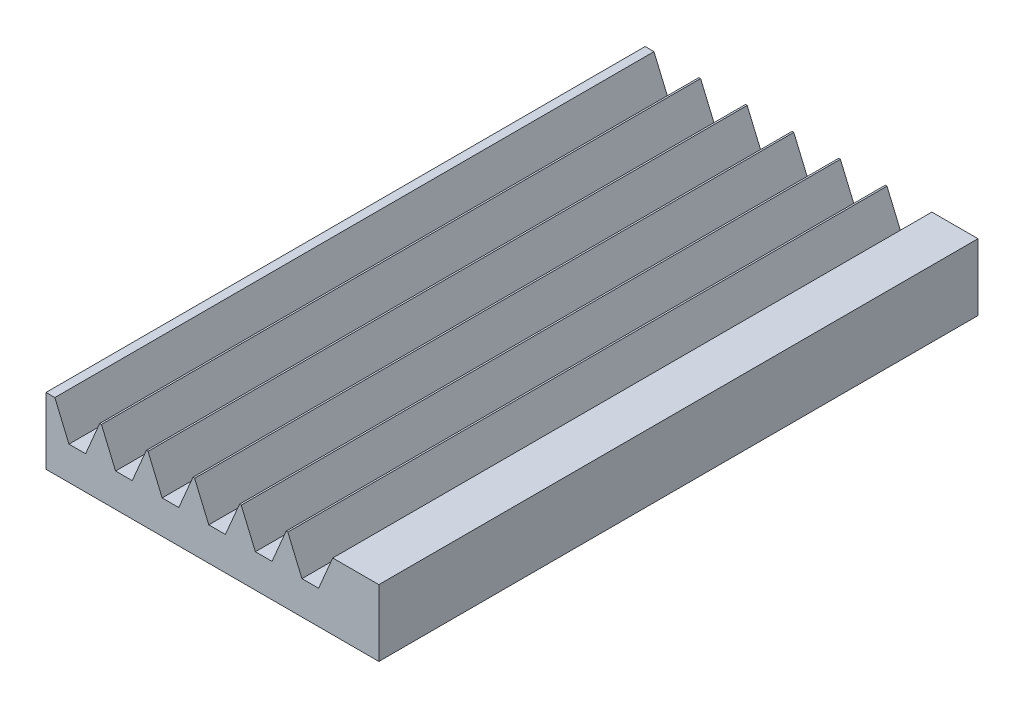
ISO-10303-21;
HEADER;
FILE_DESCRIPTION(('STEP AP214'),'2;1');
FILE_NAME('part.step','',(''),(''),'','','');
FILE_SCHEMA(('AUTOMOTIVE_DESIGN { 1 0 10303 214 1 1 1 1 }'));
ENDSEC;
DATA;
#1=APPLICATION_CONTEXT('core data for automotive mechanical design processes');
#2=APPLICATION_PROTOCOL_DEFINITION('international standard','automotive_design',2000,#1);
#3=PRODUCT_CONTEXT('',#1,'mechanical');
#4=PRODUCT('Part','Part','',(#3));
#5=PRODUCT_RELATED_PRODUCT_CATEGORY('part','',(#4));
#6=PRODUCT_DEFINITION_FORMATION('','',#4);
#7=PRODUCT_DEFINITION_CONTEXT('part definition',#1,'design');
#8=PRODUCT_DEFINITION('design','',#6,#7);
#9=PRODUCT_DEFINITION_SHAPE('','',#8);
#10=(LENGTH_UNIT() NAMED_UNIT(*) SI_UNIT(.MILLI.,.METRE.));
#11=(NAMED_UNIT(*) PLANE_ANGLE_UNIT() SI_UNIT($,.RADIAN.));
#12=(NAMED_UNIT(*) SI_UNIT($,.STERADIAN.) SOLID_ANGLE_UNIT());
#13=UNCERTAINTY_MEASURE_WITH_UNIT(LENGTH_MEASURE(1.E-05),#10,'distance_accuracy_value','');
#14=(GEOMETRIC_REPRESENTATION_CONTEXT(3) GLOBAL_UNCERTAINTY_ASSIGNED_CONTEXT((#13)) GLOBAL_UNIT_ASSIGNED_CONTEXT((#10,
#11,#12)) REPRESENTATION_CONTEXT('',''));
#15=CARTESIAN_POINT('',(0.,0.,0.));
#16=DIRECTION('',(0.,0.,1.));
#17=DIRECTION('',(1.,0.,0.));
#18=AXIS2_PLACEMENT_3D('',#15,#16,#17);
#19=CARTESIAN_POINT('',(0.,2.,-13.));
#20=DIRECTION('',(0.,1.,0.));
#21=DIRECTION('',(0.,0.,1.));
#22=AXIS2_PLACEMENT_3D('',#19,#20,#21);
#23=PLANE('',#22);
#24=DIRECTION('',(0.,0.,-1.));
#25=VECTOR('',#24,1.);
#26=CARTESIAN_POINT('',(3.01429944988273,2.,-13.));
#27=LINE('',#26,#25);
#28=CARTESIAN_POINT('',(3.01429944988273,2.,5.));
#29=VERTEX_POINT('',#28);
#30=CARTESIAN_POINT('',(3.01429944988273,2.,-13.));
#31=VERTEX_POINT('',#30);
#32=EDGE_CURVE('E337',#29,#31,#27,.T.);
#33=ORIENTED_EDGE('',*,*,#32,.F.);
#34=DIRECTION('',(-1.,0.,0.));
#35=VECTOR('',#34,1.);
#36=CARTESIAN_POINT('',(0.,2.,5.));
#37=LINE('',#36,#35);
#38=CARTESIAN_POINT('',(3.06534981746351,2.,5.));
#39=VERTEX_POINT('',#38);
#40=EDGE_CURVE('E418',#39,#29,#37,.T.);
#41=ORIENTED_EDGE('',*,*,#40,.F.);
#42=DIRECTION('',(0.,0.,1.));
#43=VECTOR('',#42,1.);
#44=CARTESIAN_POINT('',(3.06534981746351,2.,-13.));
#45=LINE('',#44,#43);
#46=CARTESIAN_POINT('',(3.06534981746351,2.,-13.));
#47=VERTEX_POINT('',#46);
#48=EDGE_CURVE('E55',#47,#39,#45,.T.);
#49=ORIENTED_EDGE('',*,*,#48,.F.);
#50=DIRECTION('',(-1.,0.,0.));
#51=VECTOR('',#50,1.);
#52=CARTESIAN_POINT('',(0.,2.,-13.));
#53=LINE('',#52,#51);
#54=EDGE_CURVE('E581',#47,#31,#53,.T.);
#55=ORIENTED_EDGE('',*,*,#54,.T.);
#56=EDGE_LOOP('',(#33,#41,#49,#55));
#57=FACE_BOUND('',#56,.T.);
#58=ADVANCED_FACE('F33',(#57),#23,.T.);
#59=DIRECTION('',(0.,0.,-1.));
#60=VECTOR('',#59,1.);
#61=CARTESIAN_POINT('',(4.41429944988273,2.,-13.));
#62=LINE('',#61,#60);
#63=CARTESIAN_POINT('',(4.41429944988273,2.,5.));
#64=VERTEX_POINT('',#63);
#65=CARTESIAN_POINT('',(4.41429944988273,2.,-13.));
#66=VERTEX_POINT('',#65);
#67=EDGE_CURVE('E334',#64,#66,#62,.T.);
#68=ORIENTED_EDGE('',*,*,#67,.F.);
#69=CARTESIAN_POINT('',(4.46534981746351,2.,5.));
#70=VERTEX_POINT('',#69);
#71=EDGE_CURVE('E424',#70,#64,#37,.T.);
#72=ORIENTED_EDGE('',*,*,#71,.F.);
#73=DIRECTION('',(0.,0.,1.));
#74=VECTOR('',#73,1.);
#75=CARTESIAN_POINT('',(4.46534981746351,2.,-13.));
#76=LINE('',#75,#74);
#77=CARTESIAN_POINT('',(4.46534981746351,2.,-13.));
#78=VERTEX_POINT('',#77);
#79=EDGE_CURVE('E329',#78,#70,#76,.T.);
#80=ORIENTED_EDGE('',*,*,#79,.F.);
#81=EDGE_CURVE('E459',#78,#66,#53,.T.);
#82=ORIENTED_EDGE('',*,*,#81,.T.);
#83=EDGE_LOOP('',(#68,#72,#80,#82));
#84=FACE_BOUND('',#83,.T.);
#85=ADVANCED_FACE('F457',(#84),#23,.T.);
#86=DIRECTION('',(0.,0.,-1.));
#87=VECTOR('',#86,1.);
#88=CARTESIAN_POINT('',(5.81429944988273,2.,-13.));
#89=LINE('',#88,#87);
#90=CARTESIAN_POINT('',(5.81429944988273,2.,5.));
#91=VERTEX_POINT('',#90);
#92=CARTESIAN_POINT('',(5.81429944988273,2.,-13.));
#93=VERTEX_POINT('',#92);
#94=EDGE_CURVE('E331',#91,#93,#89,.T.);
#95=ORIENTED_EDGE('',*,*,#94,.F.);
#96=CARTESIAN_POINT('',(5.86534981746351,2.,5.));
#97=VERTEX_POINT('',#96);
#98=EDGE_CURVE('E426',#97,#91,#37,.T.);
#99=ORIENTED_EDGE('',*,*,#98,.F.);
#100=DIRECTION('',(0.,0.,1.));
#101=VECTOR('',#100,1.);
#102=CARTESIAN_POINT('',(5.86534981746351,2.,-13.));
#103=LINE('',#102,#101);
#104=CARTESIAN_POINT('',(5.86534981746351,2.,-13.));
#105=VERTEX_POINT('',#104);
#106=EDGE_CURVE('E325',#105,#97,#103,.T.);
#107=ORIENTED_EDGE('',*,*,#106,.F.);
#108=EDGE_CURVE('E444',#105,#93,#53,.T.);
#109=ORIENTED_EDGE('',*,*,#108,.T.);
#110=EDGE_LOOP('',(#95,#99,#107,#109));
#111=FACE_BOUND('',#110,.T.);
#112=ADVANCED_FACE('F441',(#111),#23,.T.);
#113=DIRECTION('',(0.,0.,-1.));
#114=VECTOR('',#113,1.);
#115=CARTESIAN_POINT('',(7.21429944988273,2.,-13.));
#116=LINE('',#115,#114);
#117=CARTESIAN_POINT('',(7.21429944988273,2.,5.));
#118=VERTEX_POINT('',#117);
#119=CARTESIAN_POINT('',(7.21429944988273,2.,-13.));
#120=VERTEX_POINT('',#119);
#121=EDGE_CURVE('E327',#118,#120,#116,.T.);
#122=ORIENTED_EDGE('',*,*,#121,.F.);
#123=CARTESIAN_POINT('',(7.26534981746351,2.,5.));
#124=VERTEX_POINT('',#123);
#125=EDGE_CURVE('E377',#124,#118,#37,.T.);
#126=ORIENTED_EDGE('',*,*,#125,.F.);
#127=DIRECTION('',(0.,0.,1.));
#128=VECTOR('',#127,1.);
#129=CARTESIAN_POINT('',(7.26534981746351,2.,-13.));
#130=LINE('',#129,#128);
#131=CARTESIAN_POINT('',(7.26534981746351,2.,-13.));
#132=VERTEX_POINT('',#131);
#133=EDGE_CURVE('E245',#132,#124,#130,.T.);
#134=ORIENTED_EDGE('',*,*,#133,.F.);
#135=EDGE_CURVE('E392',#132,#120,#53,.T.);
#136=ORIENTED_EDGE('',*,*,#135,.T.);
#137=EDGE_LOOP('',(#122,#126,#134,#136));
#138=FACE_BOUND('',#137,.T.);
#139=ADVANCED_FACE('F504',(#138),#23,.T.);
#140=DIRECTION('',(0.,0.,-1.));
#141=VECTOR('',#140,1.);
#142=CARTESIAN_POINT('',(8.61429944988273,2.,-13.));
#143=LINE('',#142,#141);
#144=CARTESIAN_POINT('',(8.61429944988273,2.,5.));
#145=VERTEX_POINT('',#144);
#146=CARTESIAN_POINT('',(8.61429944988273,2.,-13.));
#147=VERTEX_POINT('',#146);
#148=EDGE_CURVE('E323',#145,#147,#143,.T.);
#149=ORIENTED_EDGE('',*,*,#148,.F.);
#150=CARTESIAN_POINT('',(10.,2.,5.));
#151=VERTEX_POINT('',#150);
#152=EDGE_CURVE('E373',#151,#145,#37,.T.);
#153=ORIENTED_EDGE('',*,*,#152,.F.);
#154=DIRECTION('',(0.,0.,1.));
#155=VECTOR('',#154,1.);
#156=CARTESIAN_POINT('',(10.,2.,-13.));
#157=LINE('',#156,#155);
#158=CARTESIAN_POINT('',(10.,2.,-13.));
#159=VERTEX_POINT('',#158);
#160=EDGE_CURVE('E397',#159,#151,#157,.T.);
#161=ORIENTED_EDGE('',*,*,#160,.F.);
#162=EDGE_CURVE('E388',#159,#147,#53,.T.);
#163=ORIENTED_EDGE('',*,*,#162,.T.);
#164=EDGE_LOOP('',(#149,#153,#161,#163));
#165=FACE_BOUND('',#164,.T.);
#166=ADVANCED_FACE('F499',(#165),#23,.T.);
#167=DIRECTION('',(0.,0.,1.));
#168=VECTOR('',#167,1.);
#169=CARTESIAN_POINT('',(1.66534981746351,2.,-13.));
#170=LINE('',#169,#168);
#171=CARTESIAN_POINT('',(1.66534981746351,2.,-13.));
#172=VERTEX_POINT('',#171);
#173=CARTESIAN_POINT('',(1.66534981746351,2.,5.));
#174=VERTEX_POINT('',#173);
#175=EDGE_CURVE('E48',#172,#174,#170,.T.);
#176=ORIENTED_EDGE('',*,*,#175,.F.);
#177=CARTESIAN_POINT('',(1.61429944988273,2.,-13.));
#178=VERTEX_POINT('',#177);
#179=EDGE_CURVE('E235',#172,#178,#53,.T.);
#180=ORIENTED_EDGE('',*,*,#179,.T.);
#181=DIRECTION('',(0.,0.,-1.));
#182=VECTOR('',#181,1.);
#183=CARTESIAN_POINT('',(1.61429944988273,2.,-13.));
#184=LINE('',#183,#182);
#185=CARTESIAN_POINT('',(1.61429944988273,2.,5.));
#186=VERTEX_POINT('',#185);
#187=EDGE_CURVE('E360',#186,#178,#184,.T.);
#188=ORIENTED_EDGE('',*,*,#187,.F.);
#189=EDGE_CURVE('E378',#174,#186,#37,.T.);
#190=ORIENTED_EDGE('',*,*,#189,.F.);
#191=EDGE_LOOP('',(#176,#180,#188,#190));
#192=FACE_BOUND('',#191,.T.);
#193=ADVANCED_FACE('F489',(#192),#23,.T.);
#194=CARTESIAN_POINT('',(0.,0.,-13.));
#195=DIRECTION('',(-1.,0.,0.));
#196=DIRECTION('',(0.,0.,1.));
#197=AXIS2_PLACEMENT_3D('',#194,#195,#196);
#198=PLANE('',#197);
#199=DIRECTION('',(0.,0.,1.));
#200=VECTOR('',#199,1.);
#201=CARTESIAN_POINT('',(0.,0.,-13.));
#202=LINE('',#201,#200);
#203=CARTESIAN_POINT('',(0.,0.,-13.));
#204=VERTEX_POINT('',#203);
#205=CARTESIAN_POINT('',(0.,0.,5.));
#206=VERTEX_POINT('',#205);
#207=EDGE_CURVE('E391',#204,#206,#202,.T.);
#208=ORIENTED_EDGE('',*,*,#207,.T.);
#209=DIRECTION('',(0.,-1.,0.));
#210=VECTOR('',#209,1.);
#211=CARTESIAN_POINT('',(0.,0.,5.));
#212=LINE('',#211,#210);
#213=CARTESIAN_POINT('',(0.,2.,5.));
#214=VERTEX_POINT('',#213);
#215=EDGE_CURVE('E363',#214,#206,#212,.T.);
#216=ORIENTED_EDGE('',*,*,#215,.F.);
#217=DIRECTION('',(0.,0.,1.));
#218=VECTOR('',#217,1.);
#219=CARTESIAN_POINT('',(0.,2.,-13.));
#220=LINE('',#219,#218);
#221=CARTESIAN_POINT('',(0.,2.,-13.));
#222=VERTEX_POINT('',#221);
#223=EDGE_CURVE('E393',#222,#214,#220,.T.);
#224=ORIENTED_EDGE('',*,*,#223,.F.);
#225=DIRECTION('',(0.,-1.,0.));
#226=VECTOR('',#225,1.);
#227=CARTESIAN_POINT('',(0.,0.,-13.));
#228=LINE('',#227,#226);
#229=EDGE_CURVE('E376',#222,#204,#228,.T.);
#230=ORIENTED_EDGE('',*,*,#229,.T.);
#231=EDGE_LOOP('',(#208,#216,#224,#230));
#232=FACE_BOUND('',#231,.T.);
#233=ADVANCED_FACE('F35',(#232),#198,.T.);
#234=DIRECTION('',(0.,0.,1.));
#235=VECTOR('',#234,1.);
#236=CARTESIAN_POINT('',(0.265349817463512,2.,-13.));
#237=LINE('',#236,#235);
#238=CARTESIAN_POINT('',(0.265349817463512,2.,-13.));
#239=VERTEX_POINT('',#238);
#240=CARTESIAN_POINT('',(0.265349817463512,2.,5.));
#241=VERTEX_POINT('',#240);
#242=EDGE_CURVE('E356',#239,#241,#237,.T.);
#243=ORIENTED_EDGE('',*,*,#242,.F.);
#244=EDGE_CURVE('E387',#239,#222,#53,.T.);
#245=ORIENTED_EDGE('',*,*,#244,.T.);
#246=ORIENTED_EDGE('',*,*,#223,.T.);
#247=EDGE_CURVE('E372',#241,#214,#37,.T.);
#248=ORIENTED_EDGE('',*,*,#247,.F.);
#249=EDGE_LOOP('',(#243,#245,#246,#248));
#250=FACE_BOUND('',#249,.T.);
#251=ADVANCED_FACE('F480',(#250),#23,.T.);
#252=CARTESIAN_POINT('',(10.,0.,-13.));
#253=DIRECTION('',(1.,0.,0.));
#254=DIRECTION('',(0.,0.,-1.));
#255=AXIS2_PLACEMENT_3D('',#252,#253,#254);
#256=PLANE('',#255);
#257=ORIENTED_EDGE('',*,*,#160,.T.);
#258=DIRECTION('',(0.,1.,0.));
#259=VECTOR('',#258,1.);
#260=CARTESIAN_POINT('',(10.,0.,5.));
#261=LINE('',#260,#259);
#262=CARTESIAN_POINT('',(10.,0.,5.));
#263=VERTEX_POINT('',#262);
#264=EDGE_CURVE('E369',#263,#151,#261,.T.);
#265=ORIENTED_EDGE('',*,*,#264,.F.);
#266=DIRECTION('',(0.,0.,1.));
#267=VECTOR('',#266,1.);
#268=CARTESIAN_POINT('',(10.,0.,-13.));
#269=LINE('',#268,#267);
#270=CARTESIAN_POINT('',(10.,0.,-13.));
#271=VERTEX_POINT('',#270);
#272=EDGE_CURVE('E399',#271,#263,#269,.T.);
#273=ORIENTED_EDGE('',*,*,#272,.F.);
#274=DIRECTION('',(0.,1.,0.));
#275=VECTOR('',#274,1.);
#276=CARTESIAN_POINT('',(10.,0.,-13.));
#277=LINE('',#276,#275);
#278=EDGE_CURVE('E384',#271,#159,#277,.T.);
#279=ORIENTED_EDGE('',*,*,#278,.T.);
#280=EDGE_LOOP('',(#257,#265,#273,#279));
#281=FACE_BOUND('',#280,.T.);
#282=ADVANCED_FACE('F487',(#281),#256,.T.);
#283=CARTESIAN_POINT('',(0.,0.,-13.));
#284=DIRECTION('',(0.,-1.,0.));
#285=DIRECTION('',(0.,0.,-1.));
#286=AXIS2_PLACEMENT_3D('',#283,#284,#285);
#287=PLANE('',#286);
#288=ORIENTED_EDGE('',*,*,#272,.T.);
#289=DIRECTION('',(1.,0.,0.));
#290=VECTOR('',#289,1.);
#291=CARTESIAN_POINT('',(0.,0.,5.));
#292=LINE('',#291,#290);
#293=EDGE_CURVE('E366',#206,#263,#292,.T.);
#294=ORIENTED_EDGE('',*,*,#293,.F.);
#295=ORIENTED_EDGE('',*,*,#207,.F.);
#296=DIRECTION('',(1.,0.,0.));
#297=VECTOR('',#296,1.);
#298=CARTESIAN_POINT('',(0.,0.,-13.));
#299=LINE('',#298,#297);
#300=EDGE_CURVE('E381',#204,#271,#299,.T.);
#301=ORIENTED_EDGE('',*,*,#300,.T.);
#302=EDGE_LOOP('',(#288,#294,#295,#301));
#303=FACE_BOUND('',#302,.T.);
#304=ADVANCED_FACE('F494',(#303),#287,.T.);
#305=CARTESIAN_POINT('',(0.,0.,-13.));
#306=DIRECTION('',(0.,0.,-1.));
#307=DIRECTION('',(-1.,0.,0.));
#308=AXIS2_PLACEMENT_3D('',#305,#306,#307);
#309=PLANE('',#308);
#310=DIRECTION('',(0.390731128489277,0.920504853452439,0.));
#311=VECTOR('',#310,1.);
#312=CARTESIAN_POINT('',(3.01962887501133,2.01255533879768,-13.));
#313=LINE('',#312,#311);
#314=CARTESIAN_POINT('',(2.58982463367312,1.,-13.));
#315=VERTEX_POINT('',#314);
#316=EDGE_CURVE('E236',#315,#31,#313,.T.);
#317=ORIENTED_EDGE('',*,*,#316,.T.);
#318=ORIENTED_EDGE('',*,*,#54,.F.);
#319=DIRECTION('',(0.390731128489278,-0.920504853452439,0.));
#320=VECTOR('',#319,1.);
#321=CARTESIAN_POINT('',(3.48982463367312,1.,-13.));
#322=LINE('',#321,#320);
#323=CARTESIAN_POINT('',(3.48982463367312,1.,-13.));
#324=VERTEX_POINT('',#323);
#325=EDGE_CURVE('E250',#47,#324,#322,.T.);
#326=ORIENTED_EDGE('',*,*,#325,.T.);
#327=DIRECTION('',(1.,0.,0.));
#328=VECTOR('',#327,1.);
#329=CARTESIAN_POINT('',(3.48982463367312,1.,-13.));
#330=LINE('',#329,#328);
#331=CARTESIAN_POINT('',(3.98982463367312,1.,-13.));
#332=VERTEX_POINT('',#331);
#333=EDGE_CURVE('E254',#324,#332,#330,.T.);
#334=ORIENTED_EDGE('',*,*,#333,.T.);
#335=DIRECTION('',(0.390731128489277,0.920504853452439,0.));
#336=VECTOR('',#335,1.);
#337=CARTESIAN_POINT('',(4.41962887501133,2.01255533879768,-13.));
#338=LINE('',#337,#336);
#339=EDGE_CURVE('E247',#332,#66,#338,.T.);
#340=ORIENTED_EDGE('',*,*,#339,.T.);
#341=ORIENTED_EDGE('',*,*,#81,.F.);
#342=DIRECTION('',(0.390731128489278,-0.920504853452439,0.));
#343=VECTOR('',#342,1.);
#344=CARTESIAN_POINT('',(4.88982463367312,1.,-13.));
#345=LINE('',#344,#343);
#346=CARTESIAN_POINT('',(4.88982463367312,1.,-13.));
#347=VERTEX_POINT('',#346);
#348=EDGE_CURVE('E269',#78,#347,#345,.T.);
#349=ORIENTED_EDGE('',*,*,#348,.T.);
#350=DIRECTION('',(1.,0.,0.));
#351=VECTOR('',#350,1.);
#352=CARTESIAN_POINT('',(4.88982463367312,1.,-13.));
#353=LINE('',#352,#351);
#354=CARTESIAN_POINT('',(5.38982463367312,1.,-13.));
#355=VERTEX_POINT('',#354);
#356=EDGE_CURVE('E273',#347,#355,#353,.T.);
#357=ORIENTED_EDGE('',*,*,#356,.T.);
#358=DIRECTION('',(0.390731128489277,0.920504853452439,0.));
#359=VECTOR('',#358,1.);
#360=CARTESIAN_POINT('',(5.81962887501133,2.01255533879768,-13.));
#361=LINE('',#360,#359);
#362=EDGE_CURVE('E266',#355,#93,#361,.T.);
#363=ORIENTED_EDGE('',*,*,#362,.T.);
#364=ORIENTED_EDGE('',*,*,#108,.F.);
#365=DIRECTION('',(0.390731128489278,-0.920504853452439,0.));
#366=VECTOR('',#365,1.);
#367=CARTESIAN_POINT('',(6.28982463367312,1.,-13.));
#368=LINE('',#367,#366);
#369=CARTESIAN_POINT('',(6.28982463367312,1.,-13.));
#370=VERTEX_POINT('',#369);
#371=EDGE_CURVE('E288',#105,#370,#368,.T.);
#372=ORIENTED_EDGE('',*,*,#371,.T.);
#373=DIRECTION('',(1.,0.,0.));
#374=VECTOR('',#373,1.);
#375=CARTESIAN_POINT('',(6.28982463367312,1.,-13.));
#376=LINE('',#375,#374);
#377=CARTESIAN_POINT('',(6.78982463367312,1.,-13.));
#378=VERTEX_POINT('',#377);
#379=EDGE_CURVE('E292',#370,#378,#376,.T.);
#380=ORIENTED_EDGE('',*,*,#379,.T.);
#381=DIRECTION('',(0.390731128489277,0.920504853452439,0.));
#382=VECTOR('',#381,1.);
#383=CARTESIAN_POINT('',(7.21962887501133,2.01255533879768,-13.));
#384=LINE('',#383,#382);
#385=EDGE_CURVE('E285',#378,#120,#384,.T.);
#386=ORIENTED_EDGE('',*,*,#385,.T.);
#387=ORIENTED_EDGE('',*,*,#135,.F.);
#388=DIRECTION('',(0.390731128489278,-0.920504853452439,0.));
#389=VECTOR('',#388,1.);
#390=CARTESIAN_POINT('',(7.68982463367312,1.,-13.));
#391=LINE('',#390,#389);
#392=CARTESIAN_POINT('',(7.68982463367312,1.,-13.));
#393=VERTEX_POINT('',#392);
#394=EDGE_CURVE('E307',#132,#393,#391,.T.);
#395=ORIENTED_EDGE('',*,*,#394,.T.);
#396=DIRECTION('',(1.,0.,0.));
#397=VECTOR('',#396,1.);
#398=CARTESIAN_POINT('',(7.68982463367312,1.,-13.));
#399=LINE('',#398,#397);
#400=CARTESIAN_POINT('',(8.18982463367312,1.,-13.));
#401=VERTEX_POINT('',#400);
#402=EDGE_CURVE('E311',#393,#401,#399,.T.);
#403=ORIENTED_EDGE('',*,*,#402,.T.);
#404=DIRECTION('',(0.390731128489277,0.920504853452439,0.));
#405=VECTOR('',#404,1.);
#406=CARTESIAN_POINT('',(8.61962887501133,2.01255533879768,-13.));
#407=LINE('',#406,#405);
#408=EDGE_CURVE('E304',#401,#147,#407,.T.);
#409=ORIENTED_EDGE('',*,*,#408,.T.);
#410=ORIENTED_EDGE('',*,*,#162,.F.);
#411=ORIENTED_EDGE('',*,*,#278,.F.);
#412=ORIENTED_EDGE('',*,*,#300,.F.);
#413=ORIENTED_EDGE('',*,*,#229,.F.);
#414=ORIENTED_EDGE('',*,*,#244,.F.);
#415=DIRECTION('',(0.390731128489278,-0.920504853452439,0.));
#416=VECTOR('',#415,1.);
#417=CARTESIAN_POINT('',(0.689824633673122,1.,-13.));
#418=LINE('',#417,#416);
#419=CARTESIAN_POINT('',(0.689824633673122,1.,-13.));
#420=VERTEX_POINT('',#419);
#421=EDGE_CURVE('E342',#239,#420,#418,.T.);
#422=ORIENTED_EDGE('',*,*,#421,.T.);
#423=DIRECTION('',(1.,0.,0.));
#424=VECTOR('',#423,1.);
#425=CARTESIAN_POINT('',(0.689824633673122,1.,-13.));
#426=LINE('',#425,#424);
#427=CARTESIAN_POINT('',(1.18982463367312,1.,-13.));
#428=VERTEX_POINT('',#427);
#429=EDGE_CURVE('E346',#420,#428,#426,.T.);
#430=ORIENTED_EDGE('',*,*,#429,.T.);
#431=DIRECTION('',(0.390731128489277,0.920504853452439,0.));
#432=VECTOR('',#431,1.);
#433=CARTESIAN_POINT('',(1.61962887501133,2.01255533879768,-13.));
#434=LINE('',#433,#432);
#435=EDGE_CURVE('E340',#428,#178,#434,.T.);
#436=ORIENTED_EDGE('',*,*,#435,.T.);
#437=ORIENTED_EDGE('',*,*,#179,.F.);
#438=DIRECTION('',(0.390731128489278,-0.920504853452439,0.));
#439=VECTOR('',#438,1.);
#440=CARTESIAN_POINT('',(2.08982463367312,1.,-13.));
#441=LINE('',#440,#439);
#442=CARTESIAN_POINT('',(2.08982463367312,1.,-13.));
#443=VERTEX_POINT('',#442);
#444=EDGE_CURVE('E219',#172,#443,#441,.T.);
#445=ORIENTED_EDGE('',*,*,#444,.T.);
#446=DIRECTION('',(1.,0.,0.));
#447=VECTOR('',#446,1.);
#448=CARTESIAN_POINT('',(2.08982463367312,1.,-13.));
#449=LINE('',#448,#447);
#450=EDGE_CURVE('E224',#443,#315,#449,.T.);
#451=ORIENTED_EDGE('',*,*,#450,.T.);
#452=EDGE_LOOP('',(#317,#318,#326,#334,#340,#341,#349,#357,#363,#364,#372,#380,#386,#387,#395,
#403,#409,#410,#411,#412,#413,#414,#422,#430,#436,#437,#445,#451));
#453=FACE_BOUND('',#452,.T.);
#454=ADVANCED_FACE('F233',(#453),#309,.T.);
#455=CARTESIAN_POINT('',(0.,0.,5.));
#456=DIRECTION('',(0.,0.,-1.));
#457=DIRECTION('',(-1.,0.,0.));
#458=AXIS2_PLACEMENT_3D('',#455,#456,#457);
#459=PLANE('',#458);
#460=ORIENTED_EDGE('',*,*,#40,.T.);
#461=DIRECTION('',(0.390731128489277,0.920504853452439,0.));
#462=VECTOR('',#461,1.);
#463=CARTESIAN_POINT('',(3.01962887501133,2.01255533879768,5.));
#464=LINE('',#463,#462);
#465=CARTESIAN_POINT('',(2.58982463367312,1.,5.));
#466=VERTEX_POINT('',#465);
#467=EDGE_CURVE('E241',#466,#29,#464,.T.);
#468=ORIENTED_EDGE('',*,*,#467,.F.);
#469=DIRECTION('',(1.,0.,0.));
#470=VECTOR('',#469,1.);
#471=CARTESIAN_POINT('',(2.08982463367312,1.,5.));
#472=LINE('',#471,#470);
#473=CARTESIAN_POINT('',(2.08982463367312,1.,5.));
#474=VERTEX_POINT('',#473);
#475=EDGE_CURVE('E238',#474,#466,#472,.T.);
#476=ORIENTED_EDGE('',*,*,#475,.F.);
#477=DIRECTION('',(-0.390731128489278,0.920504853452439,0.));
#478=VECTOR('',#477,1.);
#479=CARTESIAN_POINT('',(2.1304393042921,0.90431783213512,5.));
#480=LINE('',#479,#478);
#481=EDGE_CURVE('E11',#474,#174,#480,.T.);
#482=ORIENTED_EDGE('',*,*,#481,.T.);
#483=ORIENTED_EDGE('',*,*,#189,.T.);
#484=DIRECTION('',(0.390731128489277,0.920504853452439,0.));
#485=VECTOR('',#484,1.);
#486=CARTESIAN_POINT('',(1.61962887501133,2.01255533879768,5.));
#487=LINE('',#486,#485);
#488=CARTESIAN_POINT('',(1.18982463367312,1.,5.));
#489=VERTEX_POINT('',#488);
#490=EDGE_CURVE('E339',#489,#186,#487,.T.);
#491=ORIENTED_EDGE('',*,*,#490,.F.);
#492=DIRECTION('',(1.,0.,0.));
#493=VECTOR('',#492,1.);
#494=CARTESIAN_POINT('',(0.689824633673122,1.,5.));
#495=LINE('',#494,#493);
#496=CARTESIAN_POINT('',(0.689824633673122,1.,5.));
#497=VERTEX_POINT('',#496);
#498=EDGE_CURVE('E343',#497,#489,#495,.T.);
#499=ORIENTED_EDGE('',*,*,#498,.F.);
#500=DIRECTION('',(-0.390731128489278,0.920504853452439,0.));
#501=VECTOR('',#500,1.);
#502=CARTESIAN_POINT('',(0.94417844497081,0.40077997189806,5.));
#503=LINE('',#502,#501);
#504=EDGE_CURVE('E396',#497,#241,#503,.T.);
#505=ORIENTED_EDGE('',*,*,#504,.T.);
#506=ORIENTED_EDGE('',*,*,#247,.T.);
#507=ORIENTED_EDGE('',*,*,#215,.T.);
#508=ORIENTED_EDGE('',*,*,#293,.T.);
#509=ORIENTED_EDGE('',*,*,#264,.T.);
#510=ORIENTED_EDGE('',*,*,#152,.T.);
#511=DIRECTION('',(0.390731128489277,0.920504853452439,0.));
#512=VECTOR('',#511,1.);
#513=CARTESIAN_POINT('',(8.61962887501133,2.01255533879768,5.));
#514=LINE('',#513,#512);
#515=CARTESIAN_POINT('',(8.18982463367312,1.,5.));
#516=VERTEX_POINT('',#515);
#517=EDGE_CURVE('E315',#516,#145,#514,.T.);
#518=ORIENTED_EDGE('',*,*,#517,.F.);
#519=DIRECTION('',(1.,0.,0.));
#520=VECTOR('',#519,1.);
#521=CARTESIAN_POINT('',(7.68982463367312,1.,5.));
#522=LINE('',#521,#520);
#523=CARTESIAN_POINT('',(7.68982463367312,1.,5.));
#524=VERTEX_POINT('',#523);
#525=EDGE_CURVE('E308',#524,#516,#522,.T.);
#526=ORIENTED_EDGE('',*,*,#525,.F.);
#527=DIRECTION('',(-0.390731128489278,0.920504853452439,0.));
#528=VECTOR('',#527,1.);
#529=CARTESIAN_POINT('',(6.87548274157728,2.91846927308336,5.));
#530=LINE('',#529,#528);
#531=EDGE_CURVE('E404',#524,#124,#530,.T.);
#532=ORIENTED_EDGE('',*,*,#531,.T.);
#533=ORIENTED_EDGE('',*,*,#125,.T.);
#534=DIRECTION('',(0.390731128489277,0.920504853452439,0.));
#535=VECTOR('',#534,1.);
#536=CARTESIAN_POINT('',(7.21962887501133,2.01255533879768,5.));
#537=LINE('',#536,#535);
#538=CARTESIAN_POINT('',(6.78982463367312,1.,5.));
#539=VERTEX_POINT('',#538);
#540=EDGE_CURVE('E296',#539,#118,#537,.T.);
#541=ORIENTED_EDGE('',*,*,#540,.F.);
#542=DIRECTION('',(1.,0.,0.));
#543=VECTOR('',#542,1.);
#544=CARTESIAN_POINT('',(6.28982463367312,1.,5.));
#545=LINE('',#544,#543);
#546=CARTESIAN_POINT('',(6.28982463367312,1.,5.));
#547=VERTEX_POINT('',#546);
#548=EDGE_CURVE('E289',#547,#539,#545,.T.);
#549=ORIENTED_EDGE('',*,*,#548,.F.);
#550=DIRECTION('',(-0.390731128489278,0.920504853452439,0.));
#551=VECTOR('',#550,1.);
#552=CARTESIAN_POINT('',(5.68922188225598,2.4149314128463,5.));
#553=LINE('',#552,#551);
#554=EDGE_CURVE('E407',#547,#97,#553,.T.);
#555=ORIENTED_EDGE('',*,*,#554,.T.);
#556=ORIENTED_EDGE('',*,*,#98,.T.);
#557=DIRECTION('',(0.390731128489277,0.920504853452439,0.));
#558=VECTOR('',#557,1.);
#559=CARTESIAN_POINT('',(5.81962887501133,2.01255533879768,5.));
#560=LINE('',#559,#558);
#561=CARTESIAN_POINT('',(5.38982463367312,1.,5.));
#562=VERTEX_POINT('',#561);
#563=EDGE_CURVE('E277',#562,#91,#560,.T.);
#564=ORIENTED_EDGE('',*,*,#563,.F.);
#565=DIRECTION('',(1.,0.,0.));
#566=VECTOR('',#565,1.);
#567=CARTESIAN_POINT('',(4.88982463367312,1.,5.));
#568=LINE('',#567,#566);
#569=CARTESIAN_POINT('',(4.88982463367312,1.,5.));
#570=VERTEX_POINT('',#569);
#571=EDGE_CURVE('E270',#570,#562,#568,.T.);
#572=ORIENTED_EDGE('',*,*,#571,.F.);
#573=DIRECTION('',(-0.390731128489278,0.920504853452439,0.));
#574=VECTOR('',#573,1.);
#575=CARTESIAN_POINT('',(4.50296102293469,1.91139355260924,5.));
#576=LINE('',#575,#574);
#577=EDGE_CURVE('E410',#570,#70,#576,.T.);
#578=ORIENTED_EDGE('',*,*,#577,.T.);
#579=ORIENTED_EDGE('',*,*,#71,.T.);
#580=DIRECTION('',(0.390731128489277,0.920504853452439,0.));
#581=VECTOR('',#580,1.);
#582=CARTESIAN_POINT('',(4.41962887501133,2.01255533879768,5.));
#583=LINE('',#582,#581);
#584=CARTESIAN_POINT('',(3.98982463367312,1.,5.));
#585=VERTEX_POINT('',#584);
#586=EDGE_CURVE('E258',#585,#64,#583,.T.);
#587=ORIENTED_EDGE('',*,*,#586,.F.);
#588=DIRECTION('',(1.,0.,0.));
#589=VECTOR('',#588,1.);
#590=CARTESIAN_POINT('',(3.48982463367312,1.,5.));
#591=LINE('',#590,#589);
#592=CARTESIAN_POINT('',(3.48982463367312,1.,5.));
#593=VERTEX_POINT('',#592);
#594=EDGE_CURVE('E251',#593,#585,#591,.T.);
#595=ORIENTED_EDGE('',*,*,#594,.F.);
#596=DIRECTION('',(-0.390731128489278,0.920504853452439,0.));
#597=VECTOR('',#596,1.);
#598=CARTESIAN_POINT('',(3.3167001636134,1.40785569237218,5.));
#599=LINE('',#598,#597);
#600=EDGE_CURVE('E41',#593,#39,#599,.T.);
#601=ORIENTED_EDGE('',*,*,#600,.T.);
#602=EDGE_LOOP('',(#460,#468,#476,#482,#483,#491,#499,#505,#506,#507,#508,#509,#510,#518,#526,
#532,#533,#541,#549,#555,#556,#564,#572,#578,#579,#587,#595,#601));
#603=FACE_BOUND('',#602,.T.);
#604=ADVANCED_FACE('F416',(#603),#459,.F.);
#605=CARTESIAN_POINT('',(1.61962887501133,2.01255533879768,-13.));
#606=DIRECTION('',(0.920504853452439,-0.390731128489278,0.));
#607=DIRECTION('',(0.390731128489278,0.920504853452439,0.));
#608=AXIS2_PLACEMENT_3D('',#605,#606,#607);
#609=PLANE('',#608);
#610=ORIENTED_EDGE('',*,*,#187,.T.);
#611=ORIENTED_EDGE('',*,*,#435,.F.);
#612=DIRECTION('',(0.,0.,1.));
#613=VECTOR('',#612,1.);
#614=CARTESIAN_POINT('',(1.18982463367312,1.,-13.));
#615=LINE('',#614,#613);
#616=EDGE_CURVE('E354',#428,#489,#615,.T.);
#617=ORIENTED_EDGE('',*,*,#616,.T.);
#618=ORIENTED_EDGE('',*,*,#490,.T.);
#619=EDGE_LOOP('',(#610,#611,#617,#618));
#620=FACE_BOUND('',#619,.T.);
#621=ADVANCED_FACE('F509',(#620),#609,.F.);
#622=CARTESIAN_POINT('',(0.689824633673122,1.,-13.));
#623=DIRECTION('',(0.,-1.,0.));
#624=DIRECTION('',(0.,0.,-1.));
#625=AXIS2_PLACEMENT_3D('',#622,#623,#624);
#626=PLANE('',#625);
#627=ORIENTED_EDGE('',*,*,#498,.T.);
#628=ORIENTED_EDGE('',*,*,#616,.F.);
#629=ORIENTED_EDGE('',*,*,#429,.F.);
#630=DIRECTION('',(0.,0.,1.));
#631=VECTOR('',#630,1.);
#632=CARTESIAN_POINT('',(0.689824633673122,1.,-13.));
#633=LINE('',#632,#631);
#634=EDGE_CURVE('E349',#420,#497,#633,.T.);
#635=ORIENTED_EDGE('',*,*,#634,.T.);
#636=EDGE_LOOP('',(#627,#628,#629,#635));
#637=FACE_BOUND('',#636,.T.);
#638=ADVANCED_FACE('F513',(#637),#626,.F.);
#639=CARTESIAN_POINT('',(0.689824633673122,1.,-13.));
#640=DIRECTION('',(-0.920504853452439,-0.390731128489278,0.));
#641=DIRECTION('',(0.390731128489278,-0.920504853452439,0.));
#642=AXIS2_PLACEMENT_3D('',#639,#640,#641);
#643=PLANE('',#642);
#644=ORIENTED_EDGE('',*,*,#242,.T.);
#645=ORIENTED_EDGE('',*,*,#504,.F.);
#646=ORIENTED_EDGE('',*,*,#634,.F.);
#647=ORIENTED_EDGE('',*,*,#421,.F.);
#648=EDGE_LOOP('',(#644,#645,#646,#647));
#649=FACE_BOUND('',#648,.T.);
#650=ADVANCED_FACE('F566',(#649),#643,.F.);
#651=CARTESIAN_POINT('',(8.61962887501133,2.01255533879768,-13.));
#652=DIRECTION('',(0.920504853452439,-0.390731128489278,0.));
#653=DIRECTION('',(0.390731128489278,0.920504853452439,0.));
#654=AXIS2_PLACEMENT_3D('',#651,#652,#653);
#655=PLANE('',#654);
#656=ORIENTED_EDGE('',*,*,#148,.T.);
#657=ORIENTED_EDGE('',*,*,#408,.F.);
#658=DIRECTION('',(0.,0.,1.));
#659=VECTOR('',#658,1.);
#660=CARTESIAN_POINT('',(8.18982463367312,1.,-13.));
#661=LINE('',#660,#659);
#662=EDGE_CURVE('E298',#401,#516,#661,.T.);
#663=ORIENTED_EDGE('',*,*,#662,.T.);
#664=ORIENTED_EDGE('',*,*,#517,.T.);
#665=EDGE_LOOP('',(#656,#657,#663,#664));
#666=FACE_BOUND('',#665,.T.);
#667=ADVANCED_FACE('F529',(#666),#655,.F.);
#668=CARTESIAN_POINT('',(7.68982463367312,1.,-13.));
#669=DIRECTION('',(0.,-1.,0.));
#670=DIRECTION('',(0.,0.,-1.));
#671=AXIS2_PLACEMENT_3D('',#668,#669,#670);
#672=PLANE('',#671);
#673=ORIENTED_EDGE('',*,*,#525,.T.);
#674=ORIENTED_EDGE('',*,*,#662,.F.);
#675=ORIENTED_EDGE('',*,*,#402,.F.);
#676=DIRECTION('',(0.,0.,1.));
#677=VECTOR('',#676,1.);
#678=CARTESIAN_POINT('',(7.68982463367312,1.,-13.));
#679=LINE('',#678,#677);
#680=EDGE_CURVE('E314',#393,#524,#679,.T.);
#681=ORIENTED_EDGE('',*,*,#680,.T.);
#682=EDGE_LOOP('',(#673,#674,#675,#681));
#683=FACE_BOUND('',#682,.T.);
#684=ADVANCED_FACE('F533',(#683),#672,.F.);
#685=CARTESIAN_POINT('',(7.68982463367312,1.,-13.));
#686=DIRECTION('',(-0.920504853452439,-0.390731128489278,0.));
#687=DIRECTION('',(0.390731128489278,-0.920504853452439,0.));
#688=AXIS2_PLACEMENT_3D('',#685,#686,#687);
#689=PLANE('',#688);
#690=ORIENTED_EDGE('',*,*,#133,.T.);
#691=ORIENTED_EDGE('',*,*,#531,.F.);
#692=ORIENTED_EDGE('',*,*,#680,.F.);
#693=ORIENTED_EDGE('',*,*,#394,.F.);
#694=EDGE_LOOP('',(#690,#691,#692,#693));
#695=FACE_BOUND('',#694,.T.);
#696=ADVANCED_FACE('F535',(#695),#689,.F.);
#697=CARTESIAN_POINT('',(7.21962887501133,2.01255533879768,-13.));
#698=DIRECTION('',(0.920504853452439,-0.390731128489278,0.));
#699=DIRECTION('',(0.390731128489278,0.920504853452439,0.));
#700=AXIS2_PLACEMENT_3D('',#697,#698,#699);
#701=PLANE('',#700);
#702=ORIENTED_EDGE('',*,*,#121,.T.);
#703=ORIENTED_EDGE('',*,*,#385,.F.);
#704=DIRECTION('',(0.,0.,1.));
#705=VECTOR('',#704,1.);
#706=CARTESIAN_POINT('',(6.78982463367312,1.,-13.));
#707=LINE('',#706,#705);
#708=EDGE_CURVE('E279',#378,#539,#707,.T.);
#709=ORIENTED_EDGE('',*,*,#708,.T.);
#710=ORIENTED_EDGE('',*,*,#540,.T.);
#711=EDGE_LOOP('',(#702,#703,#709,#710));
#712=FACE_BOUND('',#711,.T.);
#713=ADVANCED_FACE('F543',(#712),#701,.F.);
#714=CARTESIAN_POINT('',(6.28982463367312,1.,-13.));
#715=DIRECTION('',(0.,-1.,0.));
#716=DIRECTION('',(0.,0.,-1.));
#717=AXIS2_PLACEMENT_3D('',#714,#715,#716);
#718=PLANE('',#717);
#719=ORIENTED_EDGE('',*,*,#548,.T.);
#720=ORIENTED_EDGE('',*,*,#708,.F.);
#721=ORIENTED_EDGE('',*,*,#379,.F.);
#722=DIRECTION('',(0.,0.,1.));
#723=VECTOR('',#722,1.);
#724=CARTESIAN_POINT('',(6.28982463367312,1.,-13.));
#725=LINE('',#724,#723);
#726=EDGE_CURVE('E295',#370,#547,#725,.T.);
#727=ORIENTED_EDGE('',*,*,#726,.T.);
#728=EDGE_LOOP('',(#719,#720,#721,#727));
#729=FACE_BOUND('',#728,.T.);
#730=ADVANCED_FACE('F546',(#729),#718,.F.);
#731=CARTESIAN_POINT('',(6.28982463367312,1.,-13.));
#732=DIRECTION('',(-0.920504853452439,-0.390731128489278,0.));
#733=DIRECTION('',(0.390731128489278,-0.920504853452439,0.));
#734=AXIS2_PLACEMENT_3D('',#731,#732,#733);
#735=PLANE('',#734);
#736=ORIENTED_EDGE('',*,*,#106,.T.);
#737=ORIENTED_EDGE('',*,*,#554,.F.);
#738=ORIENTED_EDGE('',*,*,#726,.F.);
#739=ORIENTED_EDGE('',*,*,#371,.F.);
#740=EDGE_LOOP('',(#736,#737,#738,#739));
#741=FACE_BOUND('',#740,.T.);
#742=ADVANCED_FACE('F548',(#741),#735,.F.);
#743=CARTESIAN_POINT('',(5.81962887501133,2.01255533879768,-13.));
#744=DIRECTION('',(0.920504853452439,-0.390731128489278,0.));
#745=DIRECTION('',(0.390731128489278,0.920504853452439,0.));
#746=AXIS2_PLACEMENT_3D('',#743,#744,#745);
#747=PLANE('',#746);
#748=ORIENTED_EDGE('',*,*,#94,.T.);
#749=ORIENTED_EDGE('',*,*,#362,.F.);
#750=DIRECTION('',(0.,0.,1.));
#751=VECTOR('',#750,1.);
#752=CARTESIAN_POINT('',(5.38982463367312,1.,-13.));
#753=LINE('',#752,#751);
#754=EDGE_CURVE('E260',#355,#562,#753,.T.);
#755=ORIENTED_EDGE('',*,*,#754,.T.);
#756=ORIENTED_EDGE('',*,*,#563,.T.);
#757=EDGE_LOOP('',(#748,#749,#755,#756));
#758=FACE_BOUND('',#757,.T.);
#759=ADVANCED_FACE('F447',(#758),#747,.F.);
#760=CARTESIAN_POINT('',(4.88982463367312,1.,-13.));
#761=DIRECTION('',(0.,-1.,0.));
#762=DIRECTION('',(0.,0.,-1.));
#763=AXIS2_PLACEMENT_3D('',#760,#761,#762);
#764=PLANE('',#763);
#765=ORIENTED_EDGE('',*,*,#571,.T.);
#766=ORIENTED_EDGE('',*,*,#754,.F.);
#767=ORIENTED_EDGE('',*,*,#356,.F.);
#768=DIRECTION('',(0.,0.,1.));
#769=VECTOR('',#768,1.);
#770=CARTESIAN_POINT('',(4.88982463367312,1.,-13.));
#771=LINE('',#770,#769);
#772=EDGE_CURVE('E276',#347,#570,#771,.T.);
#773=ORIENTED_EDGE('',*,*,#772,.T.);
#774=EDGE_LOOP('',(#765,#766,#767,#773));
#775=FACE_BOUND('',#774,.T.);
#776=ADVANCED_FACE('F451',(#775),#764,.F.);
#777=CARTESIAN_POINT('',(4.88982463367312,1.,-13.));
#778=DIRECTION('',(-0.920504853452439,-0.390731128489278,0.));
#779=DIRECTION('',(0.390731128489278,-0.920504853452439,0.));
#780=AXIS2_PLACEMENT_3D('',#777,#778,#779);
#781=PLANE('',#780);
#782=ORIENTED_EDGE('',*,*,#79,.T.);
#783=ORIENTED_EDGE('',*,*,#577,.F.);
#784=ORIENTED_EDGE('',*,*,#772,.F.);
#785=ORIENTED_EDGE('',*,*,#348,.F.);
#786=EDGE_LOOP('',(#782,#783,#784,#785));
#787=FACE_BOUND('',#786,.T.);
#788=ADVANCED_FACE('F707',(#787),#781,.F.);
#789=CARTESIAN_POINT('',(4.41962887501133,2.01255533879768,-13.));
#790=DIRECTION('',(0.920504853452439,-0.390731128489278,0.));
#791=DIRECTION('',(0.390731128489278,0.920504853452439,0.));
#792=AXIS2_PLACEMENT_3D('',#789,#790,#791);
#793=PLANE('',#792);
#794=ORIENTED_EDGE('',*,*,#67,.T.);
#795=ORIENTED_EDGE('',*,*,#339,.F.);
#796=DIRECTION('',(0.,0.,1.));
#797=VECTOR('',#796,1.);
#798=CARTESIAN_POINT('',(3.98982463367312,1.,-13.));
#799=LINE('',#798,#797);
#800=EDGE_CURVE('E243',#332,#585,#799,.T.);
#801=ORIENTED_EDGE('',*,*,#800,.T.);
#802=ORIENTED_EDGE('',*,*,#586,.T.);
#803=EDGE_LOOP('',(#794,#795,#801,#802));
#804=FACE_BOUND('',#803,.T.);
#805=ADVANCED_FACE('F462',(#804),#793,.F.);
#806=CARTESIAN_POINT('',(3.48982463367312,1.,-13.));
#807=DIRECTION('',(0.,-1.,0.));
#808=DIRECTION('',(0.,0.,-1.));
#809=AXIS2_PLACEMENT_3D('',#806,#807,#808);
#810=PLANE('',#809);
#811=ORIENTED_EDGE('',*,*,#594,.T.);
#812=ORIENTED_EDGE('',*,*,#800,.F.);
#813=ORIENTED_EDGE('',*,*,#333,.F.);
#814=DIRECTION('',(0.,0.,1.));
#815=VECTOR('',#814,1.);
#816=CARTESIAN_POINT('',(3.48982463367312,1.,-13.));
#817=LINE('',#816,#815);
#818=EDGE_CURVE('E257',#324,#593,#817,.T.);
#819=ORIENTED_EDGE('',*,*,#818,.T.);
#820=EDGE_LOOP('',(#811,#812,#813,#819));
#821=FACE_BOUND('',#820,.T.);
#822=ADVANCED_FACE('F465',(#821),#810,.F.);
#823=CARTESIAN_POINT('',(3.48982463367312,1.,-13.));
#824=DIRECTION('',(-0.920504853452439,-0.390731128489278,0.));
#825=DIRECTION('',(0.390731128489278,-0.920504853452439,0.));
#826=AXIS2_PLACEMENT_3D('',#823,#824,#825);
#827=PLANE('',#826);
#828=ORIENTED_EDGE('',*,*,#48,.T.);
#829=ORIENTED_EDGE('',*,*,#600,.F.);
#830=ORIENTED_EDGE('',*,*,#818,.F.);
#831=ORIENTED_EDGE('',*,*,#325,.F.);
#832=EDGE_LOOP('',(#828,#829,#830,#831));
#833=FACE_BOUND('',#832,.T.);
#834=ADVANCED_FACE('F466',(#833),#827,.F.);
#835=CARTESIAN_POINT('',(3.01962887501133,2.01255533879768,-13.));
#836=DIRECTION('',(0.920504853452439,-0.390731128489278,0.));
#837=DIRECTION('',(0.390731128489278,0.920504853452439,0.));
#838=AXIS2_PLACEMENT_3D('',#835,#836,#837);
#839=PLANE('',#838);
#840=ORIENTED_EDGE('',*,*,#32,.T.);
#841=ORIENTED_EDGE('',*,*,#316,.F.);
#842=DIRECTION('',(0.,0.,1.));
#843=VECTOR('',#842,1.);
#844=CARTESIAN_POINT('',(2.58982463367312,1.,-13.));
#845=LINE('',#844,#843);
#846=EDGE_CURVE('E223',#315,#466,#845,.T.);
#847=ORIENTED_EDGE('',*,*,#846,.T.);
#848=ORIENTED_EDGE('',*,*,#467,.T.);
#849=EDGE_LOOP('',(#840,#841,#847,#848));
#850=FACE_BOUND('',#849,.T.);
#851=ADVANCED_FACE('F468',(#850),#839,.F.);
#852=CARTESIAN_POINT('',(2.08982463367312,1.,-13.));
#853=DIRECTION('',(0.,-1.,0.));
#854=DIRECTION('',(0.,0.,-1.));
#855=AXIS2_PLACEMENT_3D('',#852,#853,#854);
#856=PLANE('',#855);
#857=ORIENTED_EDGE('',*,*,#475,.T.);
#858=ORIENTED_EDGE('',*,*,#846,.F.);
#859=ORIENTED_EDGE('',*,*,#450,.F.);
#860=DIRECTION('',(0.,0.,1.));
#861=VECTOR('',#860,1.);
#862=CARTESIAN_POINT('',(2.08982463367312,1.,-13.));
#863=LINE('',#862,#861);
#864=EDGE_CURVE('E215',#443,#474,#863,.T.);
#865=ORIENTED_EDGE('',*,*,#864,.T.);
#866=EDGE_LOOP('',(#857,#858,#859,#865));
#867=FACE_BOUND('',#866,.T.);
#868=ADVANCED_FACE('F227',(#867),#856,.F.);
#869=CARTESIAN_POINT('',(2.08982463367312,1.,-13.));
#870=DIRECTION('',(-0.920504853452439,-0.390731128489278,0.));
#871=DIRECTION('',(0.390731128489278,-0.920504853452439,0.));
#872=AXIS2_PLACEMENT_3D('',#869,#870,#871);
#873=PLANE('',#872);
#874=ORIENTED_EDGE('',*,*,#175,.T.);
#875=ORIENTED_EDGE('',*,*,#481,.F.);
#876=ORIENTED_EDGE('',*,*,#864,.F.);
#877=ORIENTED_EDGE('',*,*,#444,.F.);
#878=EDGE_LOOP('',(#874,#875,#876,#877));
#879=FACE_BOUND('',#878,.T.);
#880=ADVANCED_FACE('F217',(#879),#873,.F.);
#881=CLOSED_SHELL('',(#58,#85,#112,#139,#166,#193,#233,#251,#282,#304,#454,#604,#621,#638,#650,
#667,#684,#696,#713,#730,#742,#759,#776,#788,#805,#822,#834,#851,#868,#880));
#882=MANIFOLD_SOLID_BREP('B2',#881);
#883=ADVANCED_BREP_SHAPE_REPRESENTATION('',(#18,#882),#14);
#884=SHAPE_DEFINITION_REPRESENTATION(#9,#883);
ENDSEC;
END-ISO-10303-21;
